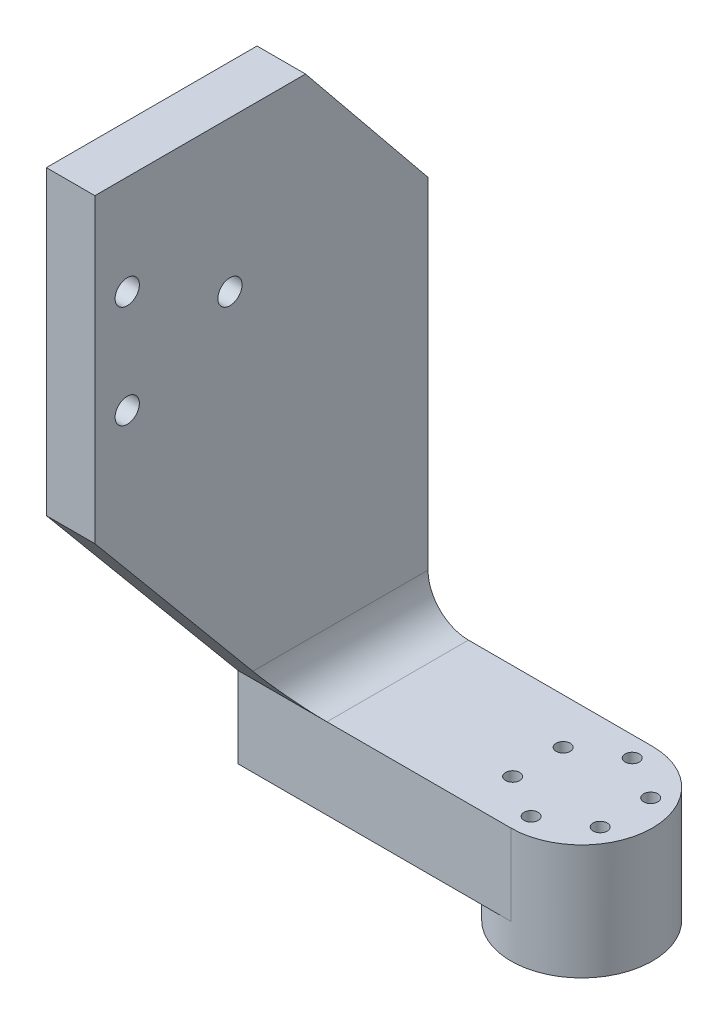
ISO-10303-21;
HEADER;
FILE_DESCRIPTION(('STEP AP214'),'2;1');
FILE_NAME('part.step','',(''),(''),'','','');
FILE_SCHEMA(('AUTOMOTIVE_DESIGN { 1 0 10303 214 1 1 1 1 }'));
ENDSEC;
DATA;
#1=APPLICATION_CONTEXT('core data for automotive mechanical design processes');
#2=APPLICATION_PROTOCOL_DEFINITION('international standard','automotive_design',2000,#1);
#3=PRODUCT_CONTEXT('',#1,'mechanical');
#4=PRODUCT('Part','Part','',(#3));
#5=PRODUCT_RELATED_PRODUCT_CATEGORY('part','',(#4));
#6=PRODUCT_DEFINITION_FORMATION('','',#4);
#7=PRODUCT_DEFINITION_CONTEXT('part definition',#1,'design');
#8=PRODUCT_DEFINITION('design','',#6,#7);
#9=PRODUCT_DEFINITION_SHAPE('','',#8);
#10=(LENGTH_UNIT() NAMED_UNIT(*) SI_UNIT(.MILLI.,.METRE.));
#11=(NAMED_UNIT(*) PLANE_ANGLE_UNIT() SI_UNIT($,.RADIAN.));
#12=(NAMED_UNIT(*) SI_UNIT($,.STERADIAN.) SOLID_ANGLE_UNIT());
#13=UNCERTAINTY_MEASURE_WITH_UNIT(LENGTH_MEASURE(1.E-05),#10,'distance_accuracy_value','');
#14=(GEOMETRIC_REPRESENTATION_CONTEXT(3) GLOBAL_UNCERTAINTY_ASSIGNED_CONTEXT((#13)) GLOBAL_UNIT_ASSIGNED_CONTEXT((#10,
#11,#12)) REPRESENTATION_CONTEXT('',''));
#15=CARTESIAN_POINT('',(0.,0.,0.));
#16=DIRECTION('',(0.,0.,1.));
#17=DIRECTION('',(1.,0.,0.));
#18=AXIS2_PLACEMENT_3D('',#15,#16,#17);
#19=CARTESIAN_POINT('',(-40.,20.,0.));
#20=DIRECTION('',(0.,1.,0.));
#21=DIRECTION('',(0.,0.,1.));
#22=AXIS2_PLACEMENT_3D('',#19,#20,#21);
#23=PLANE('',#22);
#24=CARTESIAN_POINT('',(-40.,20.,12.5));
#25=DIRECTION('',(0.,-1.,0.));
#26=DIRECTION('',(0.,0.,1.));
#27=AXIS2_PLACEMENT_3D('',#24,#25,#26);
#28=CIRCLE('',#27,1.75);
#29=CARTESIAN_POINT('',(-40.,20.,14.25));
#30=VERTEX_POINT('',#29);
#31=EDGE_CURVE('E235',#30,#30,#28,.T.);
#32=ORIENTED_EDGE('',*,*,#31,.T.);
#33=EDGE_LOOP('',(#32));
#34=FACE_BOUND('',#33,.T.);
#35=CARTESIAN_POINT('',(-29.1746824526946,20.,6.25000000000013));
#36=DIRECTION('',(0.,-1.,0.));
#37=DIRECTION('',(0.,0.,1.));
#38=AXIS2_PLACEMENT_3D('',#35,#36,#37);
#39=CIRCLE('',#38,1.75);
#40=CARTESIAN_POINT('',(-29.1746824526946,20.,8.00000000000013));
#41=VERTEX_POINT('',#40);
#42=EDGE_CURVE('E242',#41,#41,#39,.T.);
#43=ORIENTED_EDGE('',*,*,#42,.T.);
#44=EDGE_LOOP('',(#43));
#45=FACE_BOUND('',#44,.T.);
#46=CARTESIAN_POINT('',(-29.1746824526945,20.,-6.2499999999999));
#47=DIRECTION('',(0.,-1.,0.));
#48=DIRECTION('',(0.,0.,1.));
#49=AXIS2_PLACEMENT_3D('',#46,#47,#48);
#50=CIRCLE('',#49,1.75);
#51=CARTESIAN_POINT('',(-29.1746824526945,20.,-4.4999999999999));
#52=VERTEX_POINT('',#51);
#53=EDGE_CURVE('E245',#52,#52,#50,.T.);
#54=ORIENTED_EDGE('',*,*,#53,.T.);
#55=EDGE_LOOP('',(#54));
#56=FACE_BOUND('',#55,.T.);
#57=CARTESIAN_POINT('',(-39.9999999999999,20.,-12.5));
#58=DIRECTION('',(0.,-1.,0.));
#59=DIRECTION('',(0.,0.,1.));
#60=AXIS2_PLACEMENT_3D('',#57,#58,#59);
#61=CIRCLE('',#60,1.75);
#62=CARTESIAN_POINT('',(-39.9999999999999,20.,-10.75));
#63=VERTEX_POINT('',#62);
#64=EDGE_CURVE('E248',#63,#63,#61,.T.);
#65=ORIENTED_EDGE('',*,*,#64,.T.);
#66=EDGE_LOOP('',(#65));
#67=FACE_BOUND('',#66,.T.);
#68=CARTESIAN_POINT('',(-50.8253175473055,20.,-6.25000000000005));
#69=DIRECTION('',(0.,-1.,0.));
#70=DIRECTION('',(0.,0.,1.));
#71=AXIS2_PLACEMENT_3D('',#68,#69,#70);
#72=CIRCLE('',#71,1.75);
#73=CARTESIAN_POINT('',(-50.8253175473055,20.,-4.50000000000005));
#74=VERTEX_POINT('',#73);
#75=EDGE_CURVE('E251',#74,#74,#72,.T.);
#76=ORIENTED_EDGE('',*,*,#75,.T.);
#77=EDGE_LOOP('',(#76));
#78=FACE_BOUND('',#77,.T.);
#79=CARTESIAN_POINT('',(-50.8253175473055,20.,6.24999999999998));
#80=DIRECTION('',(0.,-1.,0.));
#81=DIRECTION('',(0.,0.,1.));
#82=AXIS2_PLACEMENT_3D('',#79,#80,#81);
#83=CIRCLE('',#82,1.75);
#84=CARTESIAN_POINT('',(-50.8253175473055,20.,7.99999999999997));
#85=VERTEX_POINT('',#84);
#86=EDGE_CURVE('E254',#85,#85,#83,.T.);
#87=ORIENTED_EDGE('',*,*,#86,.T.);
#88=EDGE_LOOP('',(#87));
#89=FACE_BOUND('',#88,.T.);
#90=DIRECTION('',(-1.,0.,0.));
#91=VECTOR('',#90,1.);
#92=CARTESIAN_POINT('',(-40.,20.,17.5));
#93=LINE('',#92,#91);
#94=CARTESIAN_POINT('',(-40.,20.,17.5));
#95=VERTEX_POINT('',#94);
#96=CARTESIAN_POINT('',(-85.5,20.,17.5));
#97=VERTEX_POINT('',#96);
#98=EDGE_CURVE('E154',#95,#97,#93,.T.);
#99=ORIENTED_EDGE('',*,*,#98,.F.);
#100=CARTESIAN_POINT('',(-40.,20.,0.));
#101=DIRECTION('',(0.,-1.,0.));
#102=DIRECTION('',(0.,0.,1.));
#103=AXIS2_PLACEMENT_3D('',#100,#101,#102);
#104=CIRCLE('',#103,17.5);
#105=CARTESIAN_POINT('',(-40.,20.,-17.5));
#106=VERTEX_POINT('',#105);
#107=EDGE_CURVE('E151',#106,#95,#104,.T.);
#108=ORIENTED_EDGE('',*,*,#107,.F.);
#109=DIRECTION('',(-1.,0.,0.));
#110=VECTOR('',#109,1.);
#111=CARTESIAN_POINT('',(-40.,20.,-17.5));
#112=LINE('',#111,#110);
#113=CARTESIAN_POINT('',(-85.5,20.,-17.5));
#114=VERTEX_POINT('',#113);
#115=EDGE_CURVE('E158',#106,#114,#112,.T.);
#116=ORIENTED_EDGE('',*,*,#115,.T.);
#117=DIRECTION('',(0.,0.,-1.));
#118=VECTOR('',#117,1.);
#119=CARTESIAN_POINT('',(-85.5,20.,0.));
#120=LINE('',#119,#118);
#121=EDGE_CURVE('E174',#97,#114,#120,.T.);
#122=ORIENTED_EDGE('',*,*,#121,.F.);
#123=EDGE_LOOP('',(#99,#108,#116,#122));
#124=FACE_BOUND('',#123,.T.);
#125=ADVANCED_FACE('F41',(#34,#45,#56,#67,#78,#89,#124),#23,.T.);
#126=CARTESIAN_POINT('',(-40.,0.,0.));
#127=DIRECTION('',(0.,1.,0.));
#128=DIRECTION('',(0.,0.,1.));
#129=AXIS2_PLACEMENT_3D('',#126,#127,#128);
#130=PLANE('',#129);
#131=DIRECTION('',(0.,0.,-1.));
#132=VECTOR('',#131,1.);
#133=CARTESIAN_POINT('',(-107.5,0.,0.));
#134=LINE('',#133,#132);
#135=CARTESIAN_POINT('',(-107.5,0.,17.5));
#136=VERTEX_POINT('',#135);
#137=CARTESIAN_POINT('',(-107.5,0.,-17.5));
#138=VERTEX_POINT('',#137);
#139=EDGE_CURVE('E164',#136,#138,#134,.T.);
#140=ORIENTED_EDGE('',*,*,#139,.T.);
#141=DIRECTION('',(-1.,0.,0.));
#142=VECTOR('',#141,1.);
#143=CARTESIAN_POINT('',(-40.,0.,-17.5));
#144=LINE('',#143,#142);
#145=CARTESIAN_POINT('',(-40.,0.,-17.5));
#146=VERTEX_POINT('',#145);
#147=EDGE_CURVE('E155',#146,#138,#144,.T.);
#148=ORIENTED_EDGE('',*,*,#147,.F.);
#149=CARTESIAN_POINT('',(-40.,0.,0.));
#150=DIRECTION('',(0.,1.,0.));
#151=DIRECTION('',(0.,0.,-1.));
#152=AXIS2_PLACEMENT_3D('',#149,#150,#151);
#153=CIRCLE('',#152,17.5);
#154=CARTESIAN_POINT('',(-40.,0.,17.5));
#155=VERTEX_POINT('',#154);
#156=EDGE_CURVE('E147',#146,#155,#153,.T.);
#157=ORIENTED_EDGE('',*,*,#156,.T.);
#158=DIRECTION('',(-1.,0.,0.));
#159=VECTOR('',#158,1.);
#160=CARTESIAN_POINT('',(-40.,0.,17.5));
#161=LINE('',#160,#159);
#162=EDGE_CURVE('E146',#155,#136,#161,.T.);
#163=ORIENTED_EDGE('',*,*,#162,.T.);
#164=EDGE_LOOP('',(#140,#148,#157,#163));
#165=FACE_BOUND('',#164,.T.);
#166=ADVANCED_FACE('F199',(#165),#130,.F.);
#167=CARTESIAN_POINT('',(-40.,20.,0.));
#168=DIRECTION('',(0.,-1.,0.));
#169=DIRECTION('',(0.,0.,-1.));
#170=AXIS2_PLACEMENT_3D('',#167,#168,#169);
#171=CYLINDRICAL_SURFACE('',#170,17.5);
#172=DIRECTION('',(0.,-1.,0.));
#173=VECTOR('',#172,1.);
#174=CARTESIAN_POINT('',(-40.,20.,-17.5));
#175=LINE('',#174,#173);
#176=EDGE_CURVE('E161',#106,#146,#175,.T.);
#177=ORIENTED_EDGE('',*,*,#176,.F.);
#178=ORIENTED_EDGE('',*,*,#107,.T.);
#179=DIRECTION('',(0.,-1.,0.));
#180=VECTOR('',#179,1.);
#181=CARTESIAN_POINT('',(-40.,20.,17.5));
#182=LINE('',#181,#180);
#183=EDGE_CURVE('E172',#95,#155,#182,.T.);
#184=ORIENTED_EDGE('',*,*,#183,.T.);
#185=ORIENTED_EDGE('',*,*,#156,.F.);
#186=EDGE_LOOP('',(#177,#178,#184,#185));
#187=FACE_BOUND('',#186,.T.);
#188=CARTESIAN_POINT('',(-40.,-8.5,0.));
#189=DIRECTION('',(0.,1.,0.));
#190=DIRECTION('',(0.,0.,-1.));
#191=AXIS2_PLACEMENT_3D('',#188,#189,#190);
#192=CIRCLE('',#191,17.5);
#193=CARTESIAN_POINT('',(-40.,-8.5,-17.5));
#194=VERTEX_POINT('',#193);
#195=EDGE_CURVE('E143',#194,#194,#192,.T.);
#196=ORIENTED_EDGE('',*,*,#195,.T.);
#197=EDGE_LOOP('',(#196));
#198=FACE_BOUND('',#197,.T.);
#199=ADVANCED_FACE('F194',(#187,#198),#171,.T.);
#200=CARTESIAN_POINT('',(-40.,20.,17.5));
#201=DIRECTION('',(0.,0.,-1.));
#202=DIRECTION('',(1.,0.,0.));
#203=AXIS2_PLACEMENT_3D('',#200,#201,#202);
#204=PLANE('',#203);
#205=DIRECTION('',(-1.,0.,0.));
#206=VECTOR('',#205,1.);
#207=CARTESIAN_POINT('',(-95.5,20.,17.5));
#208=LINE('',#207,#206);
#209=CARTESIAN_POINT('',(-107.5,20.,17.5));
#210=VERTEX_POINT('',#209);
#211=EDGE_CURVE('E134',#97,#210,#208,.T.);
#212=ORIENTED_EDGE('',*,*,#211,.T.);
#213=DIRECTION('',(0.,-1.,0.));
#214=VECTOR('',#213,1.);
#215=CARTESIAN_POINT('',(-107.5,20.,17.5));
#216=LINE('',#215,#214);
#217=EDGE_CURVE('E170',#210,#136,#216,.T.);
#218=ORIENTED_EDGE('',*,*,#217,.T.);
#219=ORIENTED_EDGE('',*,*,#162,.F.);
#220=ORIENTED_EDGE('',*,*,#183,.F.);
#221=ORIENTED_EDGE('',*,*,#98,.T.);
#222=EDGE_LOOP('',(#212,#218,#219,#220,#221));
#223=FACE_BOUND('',#222,.T.);
#224=ADVANCED_FACE('F307',(#223),#204,.F.);
#225=CARTESIAN_POINT('',(-107.5,20.,0.));
#226=DIRECTION('',(1.,0.,0.));
#227=DIRECTION('',(0.,0.,1.));
#228=AXIS2_PLACEMENT_3D('',#225,#226,#227);
#229=PLANE('',#228);
#230=CARTESIAN_POINT('',(-107.5,101.418307846578,56.89));
#231=DIRECTION('',(1.,0.,0.));
#232=DIRECTION('',(0.,0.,-1.));
#233=AXIS2_PLACEMENT_3D('',#230,#231,#232);
#234=CIRCLE('',#233,3.);
#235=CARTESIAN_POINT('',(-107.5,101.418307846578,53.89));
#236=VERTEX_POINT('',#235);
#237=EDGE_CURVE('E179',#236,#236,#234,.T.);
#238=ORIENTED_EDGE('',*,*,#237,.T.);
#239=EDGE_LOOP('',(#238));
#240=FACE_BOUND('',#239,.T.);
#241=CARTESIAN_POINT('',(-107.5,126.818307846578,56.89));
#242=DIRECTION('',(1.,0.,0.));
#243=DIRECTION('',(0.,0.,-1.));
#244=AXIS2_PLACEMENT_3D('',#241,#242,#243);
#245=CIRCLE('',#244,3.);
#246=CARTESIAN_POINT('',(-107.5,126.818307846578,53.89));
#247=VERTEX_POINT('',#246);
#248=EDGE_CURVE('E234',#247,#247,#245,.T.);
#249=ORIENTED_EDGE('',*,*,#248,.T.);
#250=EDGE_LOOP('',(#249));
#251=FACE_BOUND('',#250,.T.);
#252=CARTESIAN_POINT('',(-107.5,114.118307846578,31.49));
#253=DIRECTION('',(1.,0.,0.));
#254=DIRECTION('',(0.,0.,-1.));
#255=AXIS2_PLACEMENT_3D('',#252,#253,#254);
#256=CIRCLE('',#255,3.);
#257=CARTESIAN_POINT('',(-107.5,114.118307846578,28.49));
#258=VERTEX_POINT('',#257);
#259=EDGE_CURVE('E230',#258,#258,#256,.T.);
#260=ORIENTED_EDGE('',*,*,#259,.T.);
#261=EDGE_LOOP('',(#260));
#262=FACE_BOUND('',#261,.T.);
#263=ORIENTED_EDGE('',*,*,#139,.F.);
#264=ORIENTED_EDGE('',*,*,#217,.F.);
#265=DIRECTION('',(0.,0.768102847802923,0.640326491094222));
#266=VECTOR('',#265,1.);
#267=CARTESIAN_POINT('',(-107.5,-0.406780219388964,0.487952707389371));
#268=LINE('',#267,#266);
#269=CARTESIAN_POINT('',(-107.5,76.8466156931562,64.89));
#270=VERTEX_POINT('',#269);
#271=EDGE_CURVE('E185',#210,#270,#268,.T.);
#272=ORIENTED_EDGE('',*,*,#271,.T.);
#273=DIRECTION('',(0.,1.,0.));
#274=VECTOR('',#273,1.);
#275=CARTESIAN_POINT('',(-107.5,0.,64.89));
#276=LINE('',#275,#274);
#277=CARTESIAN_POINT('',(-107.5,151.39,64.89));
#278=VERTEX_POINT('',#277);
#279=EDGE_CURVE('E211',#270,#278,#276,.T.);
#280=ORIENTED_EDGE('',*,*,#279,.T.);
#281=DIRECTION('',(0.,0.,-1.));
#282=VECTOR('',#281,1.);
#283=CARTESIAN_POINT('',(-107.5,151.39,0.));
#284=LINE('',#283,#282);
#285=CARTESIAN_POINT('',(-107.5,151.39,12.79));
#286=VERTEX_POINT('',#285);
#287=EDGE_CURVE('E209',#278,#286,#284,.T.);
#288=ORIENTED_EDGE('',*,*,#287,.T.);
#289=DIRECTION('',(0.,-0.776045210433539,-0.630677279885018));
#290=VECTOR('',#289,1.);
#291=CARTESIAN_POINT('',(-107.5,53.9560906163779,-66.3926972352517));
#292=LINE('',#291,#290);
#293=CARTESIAN_POINT('',(-107.5,114.118307846578,-17.5));
#294=VERTEX_POINT('',#293);
#295=EDGE_CURVE('E206',#286,#294,#292,.T.);
#296=ORIENTED_EDGE('',*,*,#295,.T.);
#297=DIRECTION('',(0.,-1.,0.));
#298=VECTOR('',#297,1.);
#299=CARTESIAN_POINT('',(-107.5,20.,-17.5));
#300=LINE('',#299,#298);
#301=EDGE_CURVE('E132',#294,#138,#300,.T.);
#302=ORIENTED_EDGE('',*,*,#301,.T.);
#303=EDGE_LOOP('',(#263,#264,#272,#280,#288,#296,#302));
#304=FACE_BOUND('',#303,.T.);
#305=ADVANCED_FACE('F203',(#240,#251,#262,#304),#229,.F.);
#306=CARTESIAN_POINT('',(-40.,20.,-17.5));
#307=DIRECTION('',(0.,0.,-1.));
#308=DIRECTION('',(1.,0.,0.));
#309=AXIS2_PLACEMENT_3D('',#306,#307,#308);
#310=PLANE('',#309);
#311=ORIENTED_EDGE('',*,*,#301,.F.);
#312=DIRECTION('',(-1.,0.,0.));
#313=VECTOR('',#312,1.);
#314=CARTESIAN_POINT('',(-95.5,114.118307846578,-17.5));
#315=LINE('',#314,#313);
#316=CARTESIAN_POINT('',(-95.5,114.118307846578,-17.5));
#317=VERTEX_POINT('',#316);
#318=EDGE_CURVE('E118',#317,#294,#315,.T.);
#319=ORIENTED_EDGE('',*,*,#318,.F.);
#320=DIRECTION('',(0.,1.,0.));
#321=VECTOR('',#320,1.);
#322=CARTESIAN_POINT('',(-95.5,0.,-17.5));
#323=LINE('',#322,#321);
#324=CARTESIAN_POINT('',(-95.5,30.,-17.5));
#325=VERTEX_POINT('',#324);
#326=EDGE_CURVE('E123',#325,#317,#323,.T.);
#327=ORIENTED_EDGE('',*,*,#326,.F.);
#328=CARTESIAN_POINT('',(-85.5,30.,-17.5));
#329=DIRECTION('',(0.,0.,1.));
#330=DIRECTION('',(1.,0.,0.));
#331=AXIS2_PLACEMENT_3D('',#328,#329,#330);
#332=CIRCLE('',#331,10.);
#333=EDGE_CURVE('E49',#114,#325,#332,.F.);
#334=ORIENTED_EDGE('',*,*,#333,.F.);
#335=ORIENTED_EDGE('',*,*,#115,.F.);
#336=ORIENTED_EDGE('',*,*,#176,.T.);
#337=ORIENTED_EDGE('',*,*,#147,.T.);
#338=EDGE_LOOP('',(#311,#319,#327,#334,#335,#336,#337));
#339=FACE_BOUND('',#338,.T.);
#340=ADVANCED_FACE('F130',(#339),#310,.T.);
#341=CARTESIAN_POINT('',(-40.,-8.5,0.));
#342=DIRECTION('',(0.,-1.,0.));
#343=DIRECTION('',(0.,0.,-1.));
#344=AXIS2_PLACEMENT_3D('',#341,#342,#343);
#345=PLANE('',#344);
#346=CARTESIAN_POINT('',(-40.,-8.5,12.5));
#347=DIRECTION('',(0.,1.,0.));
#348=DIRECTION('',(0.,0.,-1.));
#349=AXIS2_PLACEMENT_3D('',#346,#347,#348);
#350=CIRCLE('',#349,1.75);
#351=CARTESIAN_POINT('',(-40.,-8.5,10.75));
#352=VERTEX_POINT('',#351);
#353=EDGE_CURVE('E257',#352,#352,#350,.T.);
#354=ORIENTED_EDGE('',*,*,#353,.T.);
#355=EDGE_LOOP('',(#354));
#356=FACE_BOUND('',#355,.T.);
#357=CARTESIAN_POINT('',(-29.1746824526946,-8.5,6.25000000000013));
#358=DIRECTION('',(0.,1.,0.));
#359=DIRECTION('',(0.,0.,-1.));
#360=AXIS2_PLACEMENT_3D('',#357,#358,#359);
#361=CIRCLE('',#360,1.75);
#362=CARTESIAN_POINT('',(-29.1746824526946,-8.5,4.50000000000013));
#363=VERTEX_POINT('',#362);
#364=EDGE_CURVE('E262',#363,#363,#361,.T.);
#365=ORIENTED_EDGE('',*,*,#364,.T.);
#366=EDGE_LOOP('',(#365));
#367=FACE_BOUND('',#366,.T.);
#368=CARTESIAN_POINT('',(-29.1746824526945,-8.5,-6.2499999999999));
#369=DIRECTION('',(0.,1.,0.));
#370=DIRECTION('',(0.,0.,-1.));
#371=AXIS2_PLACEMENT_3D('',#368,#369,#370);
#372=CIRCLE('',#371,1.75);
#373=CARTESIAN_POINT('',(-29.1746824526945,-8.5,-7.9999999999999));
#374=VERTEX_POINT('',#373);
#375=EDGE_CURVE('E258',#374,#374,#372,.T.);
#376=ORIENTED_EDGE('',*,*,#375,.T.);
#377=EDGE_LOOP('',(#376));
#378=FACE_BOUND('',#377,.T.);
#379=CARTESIAN_POINT('',(-39.9999999999999,-8.5,-12.5));
#380=DIRECTION('',(0.,1.,0.));
#381=DIRECTION('',(0.,0.,-1.));
#382=AXIS2_PLACEMENT_3D('',#379,#380,#381);
#383=CIRCLE('',#382,1.75);
#384=CARTESIAN_POINT('',(-39.9999999999999,-8.5,-14.25));
#385=VERTEX_POINT('',#384);
#386=EDGE_CURVE('E261',#385,#385,#383,.T.);
#387=ORIENTED_EDGE('',*,*,#386,.T.);
#388=EDGE_LOOP('',(#387));
#389=FACE_BOUND('',#388,.T.);
#390=CARTESIAN_POINT('',(-50.8253175473055,-8.5,-6.25000000000005));
#391=DIRECTION('',(0.,1.,0.));
#392=DIRECTION('',(0.,0.,-1.));
#393=AXIS2_PLACEMENT_3D('',#390,#391,#392);
#394=CIRCLE('',#393,1.75);
#395=CARTESIAN_POINT('',(-50.8253175473055,-8.5,-8.00000000000005));
#396=VERTEX_POINT('',#395);
#397=EDGE_CURVE('E265',#396,#396,#394,.T.);
#398=ORIENTED_EDGE('',*,*,#397,.T.);
#399=EDGE_LOOP('',(#398));
#400=FACE_BOUND('',#399,.T.);
#401=CARTESIAN_POINT('',(-50.8253175473055,-8.5,6.24999999999998));
#402=DIRECTION('',(0.,1.,0.));
#403=DIRECTION('',(0.,0.,-1.));
#404=AXIS2_PLACEMENT_3D('',#401,#402,#403);
#405=CIRCLE('',#404,1.75);
#406=CARTESIAN_POINT('',(-50.8253175473055,-8.5,4.49999999999998));
#407=VERTEX_POINT('',#406);
#408=EDGE_CURVE('E268',#407,#407,#405,.T.);
#409=ORIENTED_EDGE('',*,*,#408,.T.);
#410=EDGE_LOOP('',(#409));
#411=FACE_BOUND('',#410,.T.);
#412=ORIENTED_EDGE('',*,*,#195,.F.);
#413=EDGE_LOOP('',(#412));
#414=FACE_BOUND('',#413,.T.);
#415=ADVANCED_FACE('F276',(#356,#367,#378,#389,#400,#411,#414),#345,.T.);
#416=CARTESIAN_POINT('',(-95.5,-0.406780219388964,0.487952707389371));
#417=DIRECTION('',(0.,0.640326491094222,-0.768102847802923));
#418=DIRECTION('',(0.,0.768102847802923,0.640326491094222));
#419=AXIS2_PLACEMENT_3D('',#416,#417,#418);
#420=PLANE('',#419);
#421=ORIENTED_EDGE('',*,*,#271,.F.);
#422=ORIENTED_EDGE('',*,*,#211,.F.);
#423=CARTESIAN_POINT('',(-85.5,30.,25.8364681295717));
#424=DIRECTION('',(0.,-0.640326491094222,0.768102847802923));
#425=DIRECTION('',(0.,-0.768102847802923,-0.640326491094222));
#426=AXIS2_PLACEMENT_3D('',#423,#424,#425);
#427=ELLIPSE('',#426,13.0190898635566,10.);
#428=CARTESIAN_POINT('',(-95.5,30.,25.8364681295717));
#429=VERTEX_POINT('',#428);
#430=EDGE_CURVE('E11',#429,#97,#427,.T.);
#431=ORIENTED_EDGE('',*,*,#430,.F.);
#432=DIRECTION('',(0.,0.768102847802923,0.640326491094222));
#433=VECTOR('',#432,1.);
#434=CARTESIAN_POINT('',(-95.5,-0.406780219388964,0.487952707389371));
#435=LINE('',#434,#433);
#436=CARTESIAN_POINT('',(-95.5,76.8466156931562,64.89));
#437=VERTEX_POINT('',#436);
#438=EDGE_CURVE('E128',#429,#437,#435,.T.);
#439=ORIENTED_EDGE('',*,*,#438,.T.);
#440=DIRECTION('',(-1.,0.,0.));
#441=VECTOR('',#440,1.);
#442=CARTESIAN_POINT('',(-95.5,76.8466156931562,64.89));
#443=LINE('',#442,#441);
#444=EDGE_CURVE('E150',#437,#270,#443,.T.);
#445=ORIENTED_EDGE('',*,*,#444,.T.);
#446=EDGE_LOOP('',(#421,#422,#431,#439,#445));
#447=FACE_BOUND('',#446,.T.);
#448=ADVANCED_FACE('F226',(#447),#420,.F.);
#449=CARTESIAN_POINT('',(-95.5,0.,64.89));
#450=DIRECTION('',(0.,0.,-1.));
#451=DIRECTION('',(1.,0.,0.));
#452=AXIS2_PLACEMENT_3D('',#449,#450,#451);
#453=PLANE('',#452);
#454=ORIENTED_EDGE('',*,*,#279,.F.);
#455=ORIENTED_EDGE('',*,*,#444,.F.);
#456=DIRECTION('',(0.,1.,0.));
#457=VECTOR('',#456,1.);
#458=CARTESIAN_POINT('',(-95.5,0.,64.89));
#459=LINE('',#458,#457);
#460=CARTESIAN_POINT('',(-95.5,151.39,64.89));
#461=VERTEX_POINT('',#460);
#462=EDGE_CURVE('E139',#437,#461,#459,.T.);
#463=ORIENTED_EDGE('',*,*,#462,.T.);
#464=DIRECTION('',(-1.,0.,0.));
#465=VECTOR('',#464,1.);
#466=CARTESIAN_POINT('',(-95.5,151.39,64.89));
#467=LINE('',#466,#465);
#468=EDGE_CURVE('E136',#461,#278,#467,.T.);
#469=ORIENTED_EDGE('',*,*,#468,.T.);
#470=EDGE_LOOP('',(#454,#455,#463,#469));
#471=FACE_BOUND('',#470,.T.);
#472=ADVANCED_FACE('F221',(#471),#453,.F.);
#473=CARTESIAN_POINT('',(-95.5,151.39,0.));
#474=DIRECTION('',(0.,-1.,0.));
#475=DIRECTION('',(0.,0.,-1.));
#476=AXIS2_PLACEMENT_3D('',#473,#474,#475);
#477=PLANE('',#476);
#478=ORIENTED_EDGE('',*,*,#287,.F.);
#479=ORIENTED_EDGE('',*,*,#468,.F.);
#480=DIRECTION('',(0.,0.,-1.));
#481=VECTOR('',#480,1.);
#482=CARTESIAN_POINT('',(-95.5,151.39,0.));
#483=LINE('',#482,#481);
#484=CARTESIAN_POINT('',(-95.5,151.39,12.79));
#485=VERTEX_POINT('',#484);
#486=EDGE_CURVE('E122',#461,#485,#483,.T.);
#487=ORIENTED_EDGE('',*,*,#486,.T.);
#488=DIRECTION('',(-1.,0.,0.));
#489=VECTOR('',#488,1.);
#490=CARTESIAN_POINT('',(-95.5,151.39,12.79));
#491=LINE('',#490,#489);
#492=EDGE_CURVE('E120',#485,#286,#491,.T.);
#493=ORIENTED_EDGE('',*,*,#492,.T.);
#494=EDGE_LOOP('',(#478,#479,#487,#493));
#495=FACE_BOUND('',#494,.T.);
#496=ADVANCED_FACE('F224',(#495),#477,.F.);
#497=CARTESIAN_POINT('',(-95.5,53.9560906163779,-66.3926972352517));
#498=DIRECTION('',(0.,-0.630677279885018,0.776045210433539));
#499=DIRECTION('',(0.,-0.776045210433539,-0.630677279885018));
#500=AXIS2_PLACEMENT_3D('',#497,#498,#499);
#501=PLANE('',#500);
#502=ORIENTED_EDGE('',*,*,#295,.F.);
#503=ORIENTED_EDGE('',*,*,#492,.F.);
#504=DIRECTION('',(0.,-0.776045210433539,-0.630677279885018));
#505=VECTOR('',#504,1.);
#506=CARTESIAN_POINT('',(-95.5,53.9560906163779,-66.3926972352517));
#507=LINE('',#506,#505);
#508=EDGE_CURVE('E114',#485,#317,#507,.T.);
#509=ORIENTED_EDGE('',*,*,#508,.T.);
#510=ORIENTED_EDGE('',*,*,#318,.T.);
#511=EDGE_LOOP('',(#502,#503,#509,#510));
#512=FACE_BOUND('',#511,.T.);
#513=ADVANCED_FACE('F116',(#512),#501,.F.);
#514=CARTESIAN_POINT('',(-95.5,0.,0.));
#515=DIRECTION('',(-1.,0.,0.));
#516=DIRECTION('',(0.,0.,-1.));
#517=AXIS2_PLACEMENT_3D('',#514,#515,#516);
#518=PLANE('',#517);
#519=CARTESIAN_POINT('',(-95.5,101.418307846578,56.89));
#520=DIRECTION('',(1.,0.,0.));
#521=DIRECTION('',(0.,0.,-1.));
#522=AXIS2_PLACEMENT_3D('',#519,#520,#521);
#523=CIRCLE('',#522,3.);
#524=CARTESIAN_POINT('',(-95.5,101.418307846578,53.89));
#525=VERTEX_POINT('',#524);
#526=EDGE_CURVE('E182',#525,#525,#523,.T.);
#527=ORIENTED_EDGE('',*,*,#526,.F.);
#528=EDGE_LOOP('',(#527));
#529=FACE_BOUND('',#528,.T.);
#530=CARTESIAN_POINT('',(-95.5,126.818307846578,56.89));
#531=DIRECTION('',(1.,0.,0.));
#532=DIRECTION('',(0.,0.,-1.));
#533=AXIS2_PLACEMENT_3D('',#530,#531,#532);
#534=CIRCLE('',#533,3.);
#535=CARTESIAN_POINT('',(-95.5,126.818307846578,53.89));
#536=VERTEX_POINT('',#535);
#537=EDGE_CURVE('E178',#536,#536,#534,.T.);
#538=ORIENTED_EDGE('',*,*,#537,.F.);
#539=EDGE_LOOP('',(#538));
#540=FACE_BOUND('',#539,.T.);
#541=CARTESIAN_POINT('',(-95.5,114.118307846578,31.49));
#542=DIRECTION('',(1.,0.,0.));
#543=DIRECTION('',(0.,0.,-1.));
#544=AXIS2_PLACEMENT_3D('',#541,#542,#543);
#545=CIRCLE('',#544,3.);
#546=CARTESIAN_POINT('',(-95.5,114.118307846578,28.49));
#547=VERTEX_POINT('',#546);
#548=EDGE_CURVE('E175',#547,#547,#545,.T.);
#549=ORIENTED_EDGE('',*,*,#548,.F.);
#550=EDGE_LOOP('',(#549));
#551=FACE_BOUND('',#550,.T.);
#552=ORIENTED_EDGE('',*,*,#326,.T.);
#553=ORIENTED_EDGE('',*,*,#508,.F.);
#554=ORIENTED_EDGE('',*,*,#486,.F.);
#555=ORIENTED_EDGE('',*,*,#462,.F.);
#556=ORIENTED_EDGE('',*,*,#438,.F.);
#557=DIRECTION('',(0.,0.,-1.));
#558=VECTOR('',#557,1.);
#559=CARTESIAN_POINT('',(-95.5,30.,0.));
#560=LINE('',#559,#558);
#561=EDGE_CURVE('E61',#325,#429,#560,.F.);
#562=ORIENTED_EDGE('',*,*,#561,.F.);
#563=EDGE_LOOP('',(#552,#553,#554,#555,#556,#562));
#564=FACE_BOUND('',#563,.T.);
#565=ADVANCED_FACE('F126',(#529,#540,#551,#564),#518,.F.);
#566=CARTESIAN_POINT('',(-22.5,114.118307846578,31.49));
#567=DIRECTION('',(-1.,0.,0.));
#568=DIRECTION('',(0.,0.,-1.));
#569=AXIS2_PLACEMENT_3D('',#566,#567,#568);
#570=CYLINDRICAL_SURFACE('',#569,3.);
#571=ORIENTED_EDGE('',*,*,#259,.F.);
#572=EDGE_LOOP('',(#571));
#573=FACE_BOUND('',#572,.T.);
#574=ORIENTED_EDGE('',*,*,#548,.T.);
#575=EDGE_LOOP('',(#574));
#576=FACE_BOUND('',#575,.T.);
#577=ADVANCED_FACE('F374',(#573,#576),#570,.F.);
#578=CARTESIAN_POINT('',(-22.5,126.818307846578,56.89));
#579=DIRECTION('',(-1.,0.,0.));
#580=DIRECTION('',(0.,0.,-1.));
#581=AXIS2_PLACEMENT_3D('',#578,#579,#580);
#582=CYLINDRICAL_SURFACE('',#581,3.);
#583=ORIENTED_EDGE('',*,*,#248,.F.);
#584=EDGE_LOOP('',(#583));
#585=FACE_BOUND('',#584,.T.);
#586=ORIENTED_EDGE('',*,*,#537,.T.);
#587=EDGE_LOOP('',(#586));
#588=FACE_BOUND('',#587,.T.);
#589=ADVANCED_FACE('F383',(#585,#588),#582,.F.);
#590=CARTESIAN_POINT('',(-22.5,101.418307846578,56.89));
#591=DIRECTION('',(-1.,0.,0.));
#592=DIRECTION('',(0.,0.,-1.));
#593=AXIS2_PLACEMENT_3D('',#590,#591,#592);
#594=CYLINDRICAL_SURFACE('',#593,3.);
#595=ORIENTED_EDGE('',*,*,#237,.F.);
#596=EDGE_LOOP('',(#595));
#597=FACE_BOUND('',#596,.T.);
#598=ORIENTED_EDGE('',*,*,#526,.T.);
#599=EDGE_LOOP('',(#598));
#600=FACE_BOUND('',#599,.T.);
#601=ADVANCED_FACE('F392',(#597,#600),#594,.F.);
#602=CARTESIAN_POINT('',(-50.8253175473055,151.39,6.24999999999998));
#603=DIRECTION('',(0.,-1.,0.));
#604=DIRECTION('',(0.,0.,-1.));
#605=AXIS2_PLACEMENT_3D('',#602,#603,#604);
#606=CYLINDRICAL_SURFACE('',#605,1.75);
#607=ORIENTED_EDGE('',*,*,#86,.F.);
#608=EDGE_LOOP('',(#607));
#609=FACE_BOUND('',#608,.T.);
#610=ORIENTED_EDGE('',*,*,#408,.F.);
#611=EDGE_LOOP('',(#610));
#612=FACE_BOUND('',#611,.T.);
#613=ADVANCED_FACE('F401',(#609,#612),#606,.F.);
#614=CARTESIAN_POINT('',(-50.8253175473055,151.39,-6.25000000000005));
#615=DIRECTION('',(0.,-1.,0.));
#616=DIRECTION('',(0.,0.,-1.));
#617=AXIS2_PLACEMENT_3D('',#614,#615,#616);
#618=CYLINDRICAL_SURFACE('',#617,1.75);
#619=ORIENTED_EDGE('',*,*,#75,.F.);
#620=EDGE_LOOP('',(#619));
#621=FACE_BOUND('',#620,.T.);
#622=ORIENTED_EDGE('',*,*,#397,.F.);
#623=EDGE_LOOP('',(#622));
#624=FACE_BOUND('',#623,.T.);
#625=ADVANCED_FACE('F410',(#621,#624),#618,.F.);
#626=CARTESIAN_POINT('',(-39.9999999999999,151.39,-12.5));
#627=DIRECTION('',(0.,-1.,0.));
#628=DIRECTION('',(0.,0.,-1.));
#629=AXIS2_PLACEMENT_3D('',#626,#627,#628);
#630=CYLINDRICAL_SURFACE('',#629,1.75);
#631=ORIENTED_EDGE('',*,*,#64,.F.);
#632=EDGE_LOOP('',(#631));
#633=FACE_BOUND('',#632,.T.);
#634=ORIENTED_EDGE('',*,*,#386,.F.);
#635=EDGE_LOOP('',(#634));
#636=FACE_BOUND('',#635,.T.);
#637=ADVANCED_FACE('F419',(#633,#636),#630,.F.);
#638=CARTESIAN_POINT('',(-29.1746824526945,151.39,-6.2499999999999));
#639=DIRECTION('',(0.,-1.,0.));
#640=DIRECTION('',(0.,0.,-1.));
#641=AXIS2_PLACEMENT_3D('',#638,#639,#640);
#642=CYLINDRICAL_SURFACE('',#641,1.75);
#643=ORIENTED_EDGE('',*,*,#53,.F.);
#644=EDGE_LOOP('',(#643));
#645=FACE_BOUND('',#644,.T.);
#646=ORIENTED_EDGE('',*,*,#375,.F.);
#647=EDGE_LOOP('',(#646));
#648=FACE_BOUND('',#647,.T.);
#649=ADVANCED_FACE('F288',(#645,#648),#642,.F.);
#650=CARTESIAN_POINT('',(-29.1746824526946,151.39,6.25000000000013));
#651=DIRECTION('',(0.,-1.,0.));
#652=DIRECTION('',(0.,0.,-1.));
#653=AXIS2_PLACEMENT_3D('',#650,#651,#652);
#654=CYLINDRICAL_SURFACE('',#653,1.75);
#655=ORIENTED_EDGE('',*,*,#42,.F.);
#656=EDGE_LOOP('',(#655));
#657=FACE_BOUND('',#656,.T.);
#658=ORIENTED_EDGE('',*,*,#364,.F.);
#659=EDGE_LOOP('',(#658));
#660=FACE_BOUND('',#659,.T.);
#661=ADVANCED_FACE('F281',(#657,#660),#654,.F.);
#662=CARTESIAN_POINT('',(-40.,151.39,12.5));
#663=DIRECTION('',(0.,-1.,0.));
#664=DIRECTION('',(0.,0.,-1.));
#665=AXIS2_PLACEMENT_3D('',#662,#663,#664);
#666=CYLINDRICAL_SURFACE('',#665,1.75);
#667=ORIENTED_EDGE('',*,*,#31,.F.);
#668=EDGE_LOOP('',(#667));
#669=FACE_BOUND('',#668,.T.);
#670=ORIENTED_EDGE('',*,*,#353,.F.);
#671=EDGE_LOOP('',(#670));
#672=FACE_BOUND('',#671,.T.);
#673=ADVANCED_FACE('F279',(#669,#672),#666,.F.);
#674=CARTESIAN_POINT('',(-85.5,30.,0.));
#675=DIRECTION('',(0.,0.,-1.));
#676=DIRECTION('',(1.,0.,0.));
#677=AXIS2_PLACEMENT_3D('',#674,#675,#676);
#678=CYLINDRICAL_SURFACE('',#677,10.);
#679=ORIENTED_EDGE('',*,*,#430,.T.);
#680=ORIENTED_EDGE('',*,*,#121,.T.);
#681=ORIENTED_EDGE('',*,*,#333,.T.);
#682=ORIENTED_EDGE('',*,*,#561,.T.);
#683=EDGE_LOOP('',(#679,#680,#681,#682));
#684=FACE_BOUND('',#683,.T.);
#685=ADVANCED_FACE('F43',(#684),#678,.F.);
#686=CLOSED_SHELL('',(#125,#166,#199,#224,#305,#340,#415,#448,#472,#496,#513,#565,#577,#589,
#601,#613,#625,#637,#649,#661,#673,#685));
#687=MANIFOLD_SOLID_BREP('B2',#686);
#688=ADVANCED_BREP_SHAPE_REPRESENTATION('',(#18,#687),#14);
#689=SHAPE_DEFINITION_REPRESENTATION(#9,#688);
ENDSEC;
END-ISO-10303-21;
